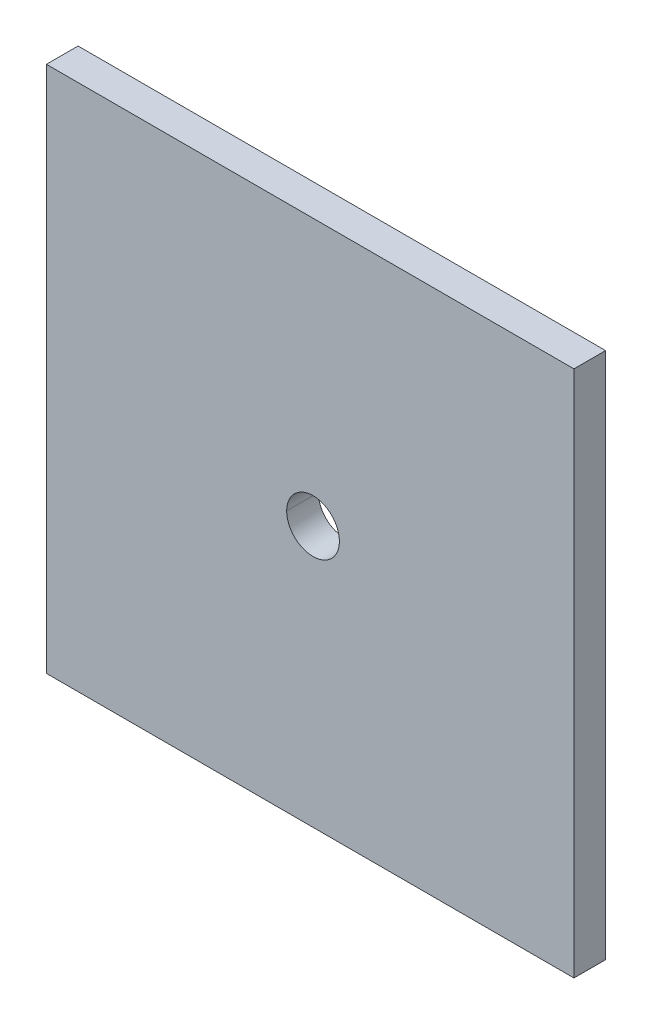
ISO-10303-21;
HEADER;
FILE_DESCRIPTION(('STEP AP214'),'2;1');
FILE_NAME('part.step','',(''),(''),'','','');
FILE_SCHEMA(('AUTOMOTIVE_DESIGN { 1 0 10303 214 1 1 1 1 }'));
ENDSEC;
DATA;
#1=APPLICATION_CONTEXT('core data for automotive mechanical design processes');
#2=APPLICATION_PROTOCOL_DEFINITION('international standard','automotive_design',2000,#1);
#3=PRODUCT_CONTEXT('',#1,'mechanical');
#4=PRODUCT('Part','Part','',(#3));
#5=PRODUCT_RELATED_PRODUCT_CATEGORY('part','',(#4));
#6=PRODUCT_DEFINITION_FORMATION('','',#4);
#7=PRODUCT_DEFINITION_CONTEXT('part definition',#1,'design');
#8=PRODUCT_DEFINITION('design','',#6,#7);
#9=PRODUCT_DEFINITION_SHAPE('','',#8);
#10=(LENGTH_UNIT() NAMED_UNIT(*) SI_UNIT(.MILLI.,.METRE.));
#11=(NAMED_UNIT(*) PLANE_ANGLE_UNIT() SI_UNIT($,.RADIAN.));
#12=(NAMED_UNIT(*) SI_UNIT($,.STERADIAN.) SOLID_ANGLE_UNIT());
#13=UNCERTAINTY_MEASURE_WITH_UNIT(LENGTH_MEASURE(1.E-05),#10,'distance_accuracy_value','');
#14=(GEOMETRIC_REPRESENTATION_CONTEXT(3) GLOBAL_UNCERTAINTY_ASSIGNED_CONTEXT((#13)) GLOBAL_UNIT_ASSIGNED_CONTEXT((#10,
#11,#12)) REPRESENTATION_CONTEXT('',''));
#15=CARTESIAN_POINT('',(0.,0.,0.));
#16=DIRECTION('',(0.,0.,1.));
#17=DIRECTION('',(1.,0.,0.));
#18=AXIS2_PLACEMENT_3D('',#15,#16,#17);
#19=CARTESIAN_POINT('',(0.270296135929205,-0.270296135929212,3.));
#20=DIRECTION('',(0.,0.,-1.));
#21=DIRECTION('',(-1.,0.,0.));
#22=AXIS2_PLACEMENT_3D('',#19,#20,#21);
#23=CYLINDRICAL_SURFACE('',#22,2.5);
#24=DIRECTION('',(0.,0.,-1.));
#25=VECTOR('',#24,1.);
#26=CARTESIAN_POINT('',(2.77029613592921,-0.270296135929212,3.));
#27=LINE('',#26,#25);
#28=CARTESIAN_POINT('',(2.77029613592921,-0.270296135929212,3.));
#29=VERTEX_POINT('',#28);
#30=CARTESIAN_POINT('',(2.77029613592921,-0.270296135929212,0.));
#31=VERTEX_POINT('',#30);
#32=EDGE_CURVE('E123',#29,#31,#27,.T.);
#33=ORIENTED_EDGE('',*,*,#32,.F.);
#34=CARTESIAN_POINT('',(0.270296135929205,-0.270296135929212,3.));
#35=DIRECTION('',(0.,0.,1.));
#36=DIRECTION('',(1.,0.,0.));
#37=AXIS2_PLACEMENT_3D('',#34,#35,#36);
#38=CIRCLE('',#37,2.5);
#39=CARTESIAN_POINT('',(-2.2297038640708,-0.270296135929212,3.));
#40=VERTEX_POINT('',#39);
#41=EDGE_CURVE('E118',#29,#40,#38,.T.);
#42=ORIENTED_EDGE('',*,*,#41,.T.);
#43=DIRECTION('',(0.,0.,-1.));
#44=VECTOR('',#43,1.);
#45=CARTESIAN_POINT('',(-2.2297038640708,-0.270296135929212,3.));
#46=LINE('',#45,#44);
#47=CARTESIAN_POINT('',(-2.2297038640708,-0.270296135929212,0.));
#48=VERTEX_POINT('',#47);
#49=EDGE_CURVE('E104',#40,#48,#46,.T.);
#50=ORIENTED_EDGE('',*,*,#49,.T.);
#51=CARTESIAN_POINT('',(0.270296135929205,-0.270296135929212,0.));
#52=DIRECTION('',(0.,0.,1.));
#53=DIRECTION('',(1.,0.,0.));
#54=AXIS2_PLACEMENT_3D('',#51,#52,#53);
#55=CIRCLE('',#54,2.5);
#56=EDGE_CURVE('E89',#31,#48,#55,.T.);
#57=ORIENTED_EDGE('',*,*,#56,.F.);
#58=EDGE_LOOP('',(#33,#42,#50,#57));
#59=FACE_BOUND('',#58,.T.);
#60=ADVANCED_FACE('F15',(#59),#23,.F.);
#61=CARTESIAN_POINT('',(-25.,-25.,3.));
#62=DIRECTION('',(0.,1.,0.));
#63=DIRECTION('',(1.,0.,0.));
#64=AXIS2_PLACEMENT_3D('',#61,#62,#63);
#65=PLANE('',#64);
#66=DIRECTION('',(1.,0.,0.));
#67=VECTOR('',#66,1.);
#68=CARTESIAN_POINT('',(-25.,-25.,0.));
#69=LINE('',#68,#67);
#70=CARTESIAN_POINT('',(-25.,-25.,0.));
#71=VERTEX_POINT('',#70);
#72=CARTESIAN_POINT('',(25.,-25.,0.));
#73=VERTEX_POINT('',#72);
#74=EDGE_CURVE('E130',#71,#73,#69,.T.);
#75=ORIENTED_EDGE('',*,*,#74,.T.);
#76=DIRECTION('',(0.,0.,-1.));
#77=VECTOR('',#76,1.);
#78=CARTESIAN_POINT('',(25.,-25.,3.));
#79=LINE('',#78,#77);
#80=CARTESIAN_POINT('',(25.,-25.,3.));
#81=VERTEX_POINT('',#80);
#82=EDGE_CURVE('E88',#81,#73,#79,.T.);
#83=ORIENTED_EDGE('',*,*,#82,.F.);
#84=DIRECTION('',(1.,0.,0.));
#85=VECTOR('',#84,1.);
#86=CARTESIAN_POINT('',(-25.,-25.,3.));
#87=LINE('',#86,#85);
#88=CARTESIAN_POINT('',(-25.,-25.,3.));
#89=VERTEX_POINT('',#88);
#90=EDGE_CURVE('E102',#89,#81,#87,.T.);
#91=ORIENTED_EDGE('',*,*,#90,.F.);
#92=DIRECTION('',(0.,0.,-1.));
#93=VECTOR('',#92,1.);
#94=CARTESIAN_POINT('',(-25.,-25.,3.));
#95=LINE('',#94,#93);
#96=EDGE_CURVE('E9',#89,#71,#95,.T.);
#97=ORIENTED_EDGE('',*,*,#96,.T.);
#98=EDGE_LOOP('',(#75,#83,#91,#97));
#99=FACE_BOUND('',#98,.T.);
#100=ADVANCED_FACE('F169',(#99),#65,.F.);
#101=CARTESIAN_POINT('',(-25.,25.,3.));
#102=DIRECTION('',(1.,0.,0.));
#103=DIRECTION('',(0.,1.,0.));
#104=AXIS2_PLACEMENT_3D('',#101,#102,#103);
#105=PLANE('',#104);
#106=DIRECTION('',(0.,-1.,0.));
#107=VECTOR('',#106,1.);
#108=CARTESIAN_POINT('',(-25.,25.,0.));
#109=LINE('',#108,#107);
#110=CARTESIAN_POINT('',(-25.,25.,0.));
#111=VERTEX_POINT('',#110);
#112=EDGE_CURVE('E115',#111,#71,#109,.T.);
#113=ORIENTED_EDGE('',*,*,#112,.T.);
#114=ORIENTED_EDGE('',*,*,#96,.F.);
#115=DIRECTION('',(0.,-1.,0.));
#116=VECTOR('',#115,1.);
#117=CARTESIAN_POINT('',(-25.,25.,3.));
#118=LINE('',#117,#116);
#119=CARTESIAN_POINT('',(-25.,25.,3.));
#120=VERTEX_POINT('',#119);
#121=EDGE_CURVE('E97',#120,#89,#118,.T.);
#122=ORIENTED_EDGE('',*,*,#121,.F.);
#123=DIRECTION('',(0.,0.,-1.));
#124=VECTOR('',#123,1.);
#125=CARTESIAN_POINT('',(-25.,25.,3.));
#126=LINE('',#125,#124);
#127=EDGE_CURVE('E26',#120,#111,#126,.T.);
#128=ORIENTED_EDGE('',*,*,#127,.T.);
#129=EDGE_LOOP('',(#113,#114,#122,#128));
#130=FACE_BOUND('',#129,.T.);
#131=ADVANCED_FACE('F175',(#130),#105,.F.);
#132=CARTESIAN_POINT('',(-25.,25.,3.));
#133=DIRECTION('',(0.,-1.,0.));
#134=DIRECTION('',(0.,0.,-1.));
#135=AXIS2_PLACEMENT_3D('',#132,#133,#134);
#136=PLANE('',#135);
#137=DIRECTION('',(-1.,0.,0.));
#138=VECTOR('',#137,1.);
#139=CARTESIAN_POINT('',(-25.,25.,0.));
#140=LINE('',#139,#138);
#141=CARTESIAN_POINT('',(25.,25.,0.));
#142=VERTEX_POINT('',#141);
#143=EDGE_CURVE('E112',#142,#111,#140,.T.);
#144=ORIENTED_EDGE('',*,*,#143,.T.);
#145=ORIENTED_EDGE('',*,*,#127,.F.);
#146=DIRECTION('',(-1.,0.,0.));
#147=VECTOR('',#146,1.);
#148=CARTESIAN_POINT('',(-25.,25.,3.));
#149=LINE('',#148,#147);
#150=CARTESIAN_POINT('',(25.,25.,3.));
#151=VERTEX_POINT('',#150);
#152=EDGE_CURVE('E92',#151,#120,#149,.T.);
#153=ORIENTED_EDGE('',*,*,#152,.F.);
#154=DIRECTION('',(0.,0.,-1.));
#155=VECTOR('',#154,1.);
#156=CARTESIAN_POINT('',(25.,25.,3.));
#157=LINE('',#156,#155);
#158=EDGE_CURVE('E81',#151,#142,#157,.T.);
#159=ORIENTED_EDGE('',*,*,#158,.T.);
#160=EDGE_LOOP('',(#144,#145,#153,#159));
#161=FACE_BOUND('',#160,.T.);
#162=ADVANCED_FACE('F93',(#161),#136,.F.);
#163=CARTESIAN_POINT('',(25.,25.,3.));
#164=DIRECTION('',(-1.,0.,0.));
#165=DIRECTION('',(0.,1.,0.));
#166=AXIS2_PLACEMENT_3D('',#163,#164,#165);
#167=PLANE('',#166);
#168=DIRECTION('',(0.,1.,0.));
#169=VECTOR('',#168,1.);
#170=CARTESIAN_POINT('',(25.,25.,0.));
#171=LINE('',#170,#169);
#172=EDGE_CURVE('E85',#73,#142,#171,.T.);
#173=ORIENTED_EDGE('',*,*,#172,.T.);
#174=ORIENTED_EDGE('',*,*,#158,.F.);
#175=DIRECTION('',(0.,1.,0.));
#176=VECTOR('',#175,1.);
#177=CARTESIAN_POINT('',(25.,25.,3.));
#178=LINE('',#177,#176);
#179=EDGE_CURVE('E83',#81,#151,#178,.T.);
#180=ORIENTED_EDGE('',*,*,#179,.F.);
#181=ORIENTED_EDGE('',*,*,#82,.T.);
#182=EDGE_LOOP('',(#173,#174,#180,#181));
#183=FACE_BOUND('',#182,.T.);
#184=ADVANCED_FACE('F17',(#183),#167,.F.);
#185=CARTESIAN_POINT('',(0.,0.,0.));
#186=DIRECTION('',(0.,0.,1.));
#187=DIRECTION('',(1.,0.,0.));
#188=AXIS2_PLACEMENT_3D('',#185,#186,#187);
#189=PLANE('',#188);
#190=CARTESIAN_POINT('',(0.270296135929205,-0.270296135929212,0.));
#191=DIRECTION('',(0.,0.,1.));
#192=DIRECTION('',(1.,0.,0.));
#193=AXIS2_PLACEMENT_3D('',#190,#191,#192);
#194=CIRCLE('',#193,2.5);
#195=EDGE_CURVE('E19',#48,#31,#194,.T.);
#196=ORIENTED_EDGE('',*,*,#195,.T.);
#197=ORIENTED_EDGE('',*,*,#56,.T.);
#198=EDGE_LOOP('',(#196,#197));
#199=FACE_BOUND('',#198,.T.);
#200=ORIENTED_EDGE('',*,*,#172,.F.);
#201=ORIENTED_EDGE('',*,*,#74,.F.);
#202=ORIENTED_EDGE('',*,*,#112,.F.);
#203=ORIENTED_EDGE('',*,*,#143,.F.);
#204=EDGE_LOOP('',(#200,#201,#202,#203));
#205=FACE_BOUND('',#204,.T.);
#206=ADVANCED_FACE('F155',(#199,#205),#189,.F.);
#207=CARTESIAN_POINT('',(0.,0.,3.));
#208=DIRECTION('',(0.,0.,1.));
#209=DIRECTION('',(1.,0.,0.));
#210=AXIS2_PLACEMENT_3D('',#207,#208,#209);
#211=PLANE('',#210);
#212=CARTESIAN_POINT('',(0.270296135929205,-0.270296135929212,3.));
#213=DIRECTION('',(0.,0.,1.));
#214=DIRECTION('',(1.,0.,0.));
#215=AXIS2_PLACEMENT_3D('',#212,#213,#214);
#216=CIRCLE('',#215,2.5);
#217=EDGE_CURVE('E119',#40,#29,#216,.T.);
#218=ORIENTED_EDGE('',*,*,#217,.F.);
#219=ORIENTED_EDGE('',*,*,#41,.F.);
#220=EDGE_LOOP('',(#218,#219));
#221=FACE_BOUND('',#220,.T.);
#222=ORIENTED_EDGE('',*,*,#179,.T.);
#223=ORIENTED_EDGE('',*,*,#152,.T.);
#224=ORIENTED_EDGE('',*,*,#121,.T.);
#225=ORIENTED_EDGE('',*,*,#90,.T.);
#226=EDGE_LOOP('',(#222,#223,#224,#225));
#227=FACE_BOUND('',#226,.T.);
#228=ADVANCED_FACE('F100',(#221,#227),#211,.T.);
#229=CARTESIAN_POINT('',(0.270296135929205,-0.270296135929212,3.));
#230=DIRECTION('',(0.,0.,-1.));
#231=DIRECTION('',(-1.,0.,0.));
#232=AXIS2_PLACEMENT_3D('',#229,#230,#231);
#233=CYLINDRICAL_SURFACE('',#232,2.5);
#234=ORIENTED_EDGE('',*,*,#217,.T.);
#235=ORIENTED_EDGE('',*,*,#32,.T.);
#236=ORIENTED_EDGE('',*,*,#195,.F.);
#237=ORIENTED_EDGE('',*,*,#49,.F.);
#238=EDGE_LOOP('',(#234,#235,#236,#237));
#239=FACE_BOUND('',#238,.T.);
#240=ADVANCED_FACE('F160',(#239),#233,.F.);
#241=CLOSED_SHELL('',(#60,#100,#131,#162,#184,#206,#228,#240));
#242=MANIFOLD_SOLID_BREP('B1',#241);
#243=ADVANCED_BREP_SHAPE_REPRESENTATION('',(#18,#242),#14);
#244=SHAPE_DEFINITION_REPRESENTATION(#9,#243);
ENDSEC;
END-ISO-10303-21;
